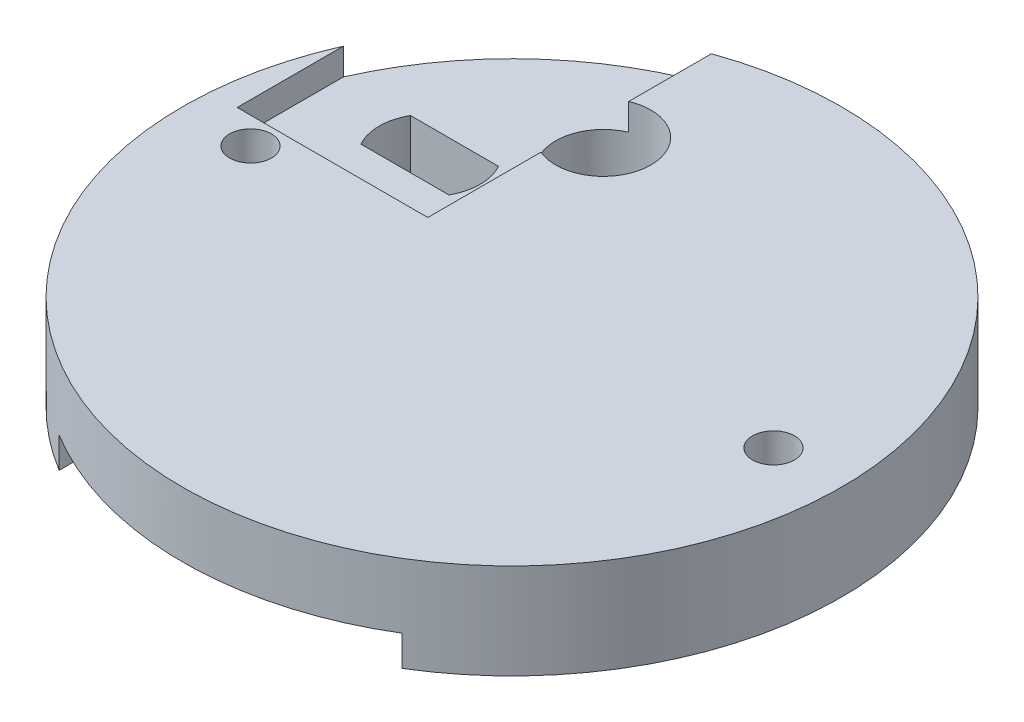
ISO-10303-21;
HEADER;
FILE_DESCRIPTION(('STEP AP214'),'2;1');
FILE_NAME('part.step','',(''),(''),'','','');
FILE_SCHEMA(('AUTOMOTIVE_DESIGN { 1 0 10303 214 1 1 1 1 }'));
ENDSEC;
DATA;
#1=APPLICATION_CONTEXT('core data for automotive mechanical design processes');
#2=APPLICATION_PROTOCOL_DEFINITION('international standard','automotive_design',2000,#1);
#3=PRODUCT_CONTEXT('',#1,'mechanical');
#4=PRODUCT('Part','Part','',(#3));
#5=PRODUCT_RELATED_PRODUCT_CATEGORY('part','',(#4));
#6=PRODUCT_DEFINITION_FORMATION('','',#4);
#7=PRODUCT_DEFINITION_CONTEXT('part definition',#1,'design');
#8=PRODUCT_DEFINITION('design','',#6,#7);
#9=PRODUCT_DEFINITION_SHAPE('','',#8);
#10=(LENGTH_UNIT() NAMED_UNIT(*) SI_UNIT(.MILLI.,.METRE.));
#11=(NAMED_UNIT(*) PLANE_ANGLE_UNIT() SI_UNIT($,.RADIAN.));
#12=(NAMED_UNIT(*) SI_UNIT($,.STERADIAN.) SOLID_ANGLE_UNIT());
#13=UNCERTAINTY_MEASURE_WITH_UNIT(LENGTH_MEASURE(1.E-05),#10,'distance_accuracy_value','');
#14=(GEOMETRIC_REPRESENTATION_CONTEXT(3) GLOBAL_UNCERTAINTY_ASSIGNED_CONTEXT((#13)) GLOBAL_UNIT_ASSIGNED_CONTEXT((#10,
#11,#12)) REPRESENTATION_CONTEXT('',''));
#15=CARTESIAN_POINT('',(0.,0.,0.));
#16=DIRECTION('',(0.,0.,1.));
#17=DIRECTION('',(1.,0.,0.));
#18=AXIS2_PLACEMENT_3D('',#15,#16,#17);
#19=CARTESIAN_POINT('',(-10.,4.,-5.68));
#20=DIRECTION('',(0.,-1.,0.));
#21=DIRECTION('',(0.,0.,-1.));
#22=AXIS2_PLACEMENT_3D('',#19,#20,#21);
#23=CYLINDRICAL_SURFACE('',#22,2.65);
#24=DIRECTION('',(0.,-1.,0.));
#25=VECTOR('',#24,1.);
#26=CARTESIAN_POINT('',(-12.3092206477511,4.,-6.98));
#27=LINE('',#26,#25);
#28=CARTESIAN_POINT('',(-12.3092206477511,3.6,-6.98));
#29=VERTEX_POINT('',#28);
#30=CARTESIAN_POINT('',(-12.3092206477511,0.,-6.98));
#31=VERTEX_POINT('',#30);
#32=EDGE_CURVE('E411',#29,#31,#27,.T.);
#33=ORIENTED_EDGE('',*,*,#32,.F.);
#34=CARTESIAN_POINT('',(-10.,3.6,-5.68));
#35=DIRECTION('',(0.,1.,0.));
#36=DIRECTION('',(0.,0.,1.));
#37=AXIS2_PLACEMENT_3D('',#34,#35,#36);
#38=CIRCLE('',#37,2.65);
#39=CARTESIAN_POINT('',(-12.3092206477511,3.6,-4.38));
#40=VERTEX_POINT('',#39);
#41=EDGE_CURVE('E50',#29,#40,#38,.T.);
#42=ORIENTED_EDGE('',*,*,#41,.T.);
#43=DIRECTION('',(0.,-1.,0.));
#44=VECTOR('',#43,1.);
#45=CARTESIAN_POINT('',(-12.3092206477511,4.,-4.38));
#46=LINE('',#45,#44);
#47=CARTESIAN_POINT('',(-12.3092206477511,0.,-4.38));
#48=VERTEX_POINT('',#47);
#49=EDGE_CURVE('E417',#40,#48,#46,.T.);
#50=ORIENTED_EDGE('',*,*,#49,.T.);
#51=CARTESIAN_POINT('',(-10.,0.,-5.68));
#52=DIRECTION('',(0.,1.,0.));
#53=DIRECTION('',(0.,0.,1.));
#54=AXIS2_PLACEMENT_3D('',#51,#52,#53);
#55=CIRCLE('',#54,2.65);
#56=EDGE_CURVE('E393',#31,#48,#55,.T.);
#57=ORIENTED_EDGE('',*,*,#56,.F.);
#58=EDGE_LOOP('',(#33,#42,#50,#57));
#59=FACE_BOUND('',#58,.T.);
#60=ADVANCED_FACE('F35',(#59),#23,.F.);
#61=CARTESIAN_POINT('',(-12.3092206477511,4.,-4.38));
#62=DIRECTION('',(0.,0.,-1.));
#63=DIRECTION('',(-1.,0.,0.));
#64=AXIS2_PLACEMENT_3D('',#61,#62,#63);
#65=PLANE('',#64);
#66=ORIENTED_EDGE('',*,*,#49,.F.);
#67=DIRECTION('',(1.,0.,0.));
#68=VECTOR('',#67,1.);
#69=CARTESIAN_POINT('',(-12.3092206477511,3.6,-4.38));
#70=LINE('',#69,#68);
#71=CARTESIAN_POINT('',(-7.6907793522489,3.6,-4.38));
#72=VERTEX_POINT('',#71);
#73=EDGE_CURVE('E273',#40,#72,#70,.T.);
#74=ORIENTED_EDGE('',*,*,#73,.T.);
#75=DIRECTION('',(0.,-1.,0.));
#76=VECTOR('',#75,1.);
#77=CARTESIAN_POINT('',(-7.6907793522489,4.,-4.38));
#78=LINE('',#77,#76);
#79=CARTESIAN_POINT('',(-7.6907793522489,0.,-4.38));
#80=VERTEX_POINT('',#79);
#81=EDGE_CURVE('E415',#72,#80,#78,.T.);
#82=ORIENTED_EDGE('',*,*,#81,.T.);
#83=DIRECTION('',(1.,0.,0.));
#84=VECTOR('',#83,1.);
#85=CARTESIAN_POINT('',(-12.3092206477511,0.,-4.38));
#86=LINE('',#85,#84);
#87=EDGE_CURVE('E402',#48,#80,#86,.T.);
#88=ORIENTED_EDGE('',*,*,#87,.F.);
#89=EDGE_LOOP('',(#66,#74,#82,#88));
#90=FACE_BOUND('',#89,.T.);
#91=ADVANCED_FACE('F516',(#90),#65,.T.);
#92=CARTESIAN_POINT('',(-10.,4.,-5.68));
#93=DIRECTION('',(0.,-1.,0.));
#94=DIRECTION('',(0.,0.,-1.));
#95=AXIS2_PLACEMENT_3D('',#92,#93,#94);
#96=CYLINDRICAL_SURFACE('',#95,2.65);
#97=ORIENTED_EDGE('',*,*,#81,.F.);
#98=CARTESIAN_POINT('',(-10.,3.6,-5.68));
#99=DIRECTION('',(0.,1.,0.));
#100=DIRECTION('',(0.,0.,1.));
#101=AXIS2_PLACEMENT_3D('',#98,#99,#100);
#102=CIRCLE('',#101,2.65);
#103=CARTESIAN_POINT('',(-7.6907793522489,3.6,-6.98));
#104=VERTEX_POINT('',#103);
#105=EDGE_CURVE('E270',#72,#104,#102,.T.);
#106=ORIENTED_EDGE('',*,*,#105,.T.);
#107=DIRECTION('',(0.,-1.,0.));
#108=VECTOR('',#107,1.);
#109=CARTESIAN_POINT('',(-7.6907793522489,4.,-6.98));
#110=LINE('',#109,#108);
#111=CARTESIAN_POINT('',(-7.6907793522489,0.,-6.98));
#112=VERTEX_POINT('',#111);
#113=EDGE_CURVE('E413',#104,#112,#110,.T.);
#114=ORIENTED_EDGE('',*,*,#113,.T.);
#115=CARTESIAN_POINT('',(-10.,0.,-5.68));
#116=DIRECTION('',(0.,1.,0.));
#117=DIRECTION('',(0.,0.,1.));
#118=AXIS2_PLACEMENT_3D('',#115,#116,#117);
#119=CIRCLE('',#118,2.65);
#120=EDGE_CURVE('E405',#80,#112,#119,.T.);
#121=ORIENTED_EDGE('',*,*,#120,.F.);
#122=EDGE_LOOP('',(#97,#106,#114,#121));
#123=FACE_BOUND('',#122,.T.);
#124=ADVANCED_FACE('F520',(#123),#96,.F.);
#125=CARTESIAN_POINT('',(-12.3092206477511,4.,-6.98));
#126=DIRECTION('',(0.,0.,1.));
#127=DIRECTION('',(1.,0.,0.));
#128=AXIS2_PLACEMENT_3D('',#125,#126,#127);
#129=PLANE('',#128);
#130=ORIENTED_EDGE('',*,*,#113,.F.);
#131=DIRECTION('',(-1.,0.,0.));
#132=VECTOR('',#131,1.);
#133=CARTESIAN_POINT('',(-12.3092206477511,3.6,-6.98));
#134=LINE('',#133,#132);
#135=EDGE_CURVE('E11',#104,#29,#134,.T.);
#136=ORIENTED_EDGE('',*,*,#135,.T.);
#137=ORIENTED_EDGE('',*,*,#32,.T.);
#138=DIRECTION('',(-1.,0.,0.));
#139=VECTOR('',#138,1.);
#140=CARTESIAN_POINT('',(-12.3092206477511,0.,-6.98));
#141=LINE('',#140,#139);
#142=EDGE_CURVE('E408',#112,#31,#141,.T.);
#143=ORIENTED_EDGE('',*,*,#142,.F.);
#144=EDGE_LOOP('',(#130,#136,#137,#143));
#145=FACE_BOUND('',#144,.T.);
#146=ADVANCED_FACE('F507',(#145),#129,.T.);
#147=CARTESIAN_POINT('',(0.,0.,0.));
#148=DIRECTION('',(0.,1.,0.));
#149=DIRECTION('',(0.,0.,1.));
#150=AXIS2_PLACEMENT_3D('',#147,#148,#149);
#151=PLANE('',#150);
#152=DIRECTION('',(1.,0.,0.));
#153=VECTOR('',#152,1.);
#154=CARTESIAN_POINT('',(6.,0.,-2.8));
#155=LINE('',#154,#153);
#156=CARTESIAN_POINT('',(6.,0.,-2.8));
#157=VERTEX_POINT('',#156);
#158=CARTESIAN_POINT('',(10.,0.,-2.8));
#159=VERTEX_POINT('',#158);
#160=EDGE_CURVE('E330',#157,#159,#155,.T.);
#161=ORIENTED_EDGE('',*,*,#160,.F.);
#162=DIRECTION('',(0.,0.,-1.));
#163=VECTOR('',#162,1.);
#164=CARTESIAN_POINT('',(6.,0.,0.6));
#165=LINE('',#164,#163);
#166=CARTESIAN_POINT('',(6.,0.,0.6));
#167=VERTEX_POINT('',#166);
#168=EDGE_CURVE('E328',#167,#157,#165,.T.);
#169=ORIENTED_EDGE('',*,*,#168,.F.);
#170=DIRECTION('',(-1.,0.,0.));
#171=VECTOR('',#170,1.);
#172=CARTESIAN_POINT('',(6.,0.,0.6));
#173=LINE('',#172,#171);
#174=CARTESIAN_POINT('',(10.,0.,0.6));
#175=VERTEX_POINT('',#174);
#176=EDGE_CURVE('E318',#175,#167,#173,.T.);
#177=ORIENTED_EDGE('',*,*,#176,.F.);
#178=DIRECTION('',(0.,0.,1.));
#179=VECTOR('',#178,1.);
#180=CARTESIAN_POINT('',(10.,0.,0.6));
#181=LINE('',#180,#179);
#182=EDGE_CURVE('E334',#159,#175,#181,.T.);
#183=ORIENTED_EDGE('',*,*,#182,.F.);
#184=EDGE_LOOP('',(#161,#169,#177,#183));
#185=FACE_BOUND('',#184,.T.);
#186=DIRECTION('',(1.,0.,0.));
#187=VECTOR('',#186,1.);
#188=CARTESIAN_POINT('',(-9.22,0.,-1.5));
#189=LINE('',#188,#187);
#190=CARTESIAN_POINT('',(-9.22,0.,-1.5));
#191=VERTEX_POINT('',#190);
#192=CARTESIAN_POINT('',(-5.22,0.,-1.5));
#193=VERTEX_POINT('',#192);
#194=EDGE_CURVE('E383',#191,#193,#189,.T.);
#195=ORIENTED_EDGE('',*,*,#194,.F.);
#196=DIRECTION('',(0.,0.,-1.));
#197=VECTOR('',#196,1.);
#198=CARTESIAN_POINT('',(-9.22,0.,3.3));
#199=LINE('',#198,#197);
#200=CARTESIAN_POINT('',(-9.22,0.,3.3));
#201=VERTEX_POINT('',#200);
#202=EDGE_CURVE('E341',#201,#191,#199,.T.);
#203=ORIENTED_EDGE('',*,*,#202,.F.);
#204=DIRECTION('',(-1.,0.,0.));
#205=VECTOR('',#204,1.);
#206=CARTESIAN_POINT('',(-9.22,0.,3.3));
#207=LINE('',#206,#205);
#208=CARTESIAN_POINT('',(-5.22,0.,3.3));
#209=VERTEX_POINT('',#208);
#210=EDGE_CURVE('E372',#209,#201,#207,.T.);
#211=ORIENTED_EDGE('',*,*,#210,.F.);
#212=DIRECTION('',(0.,0.,1.));
#213=VECTOR('',#212,1.);
#214=CARTESIAN_POINT('',(-5.22,0.,3.3));
#215=LINE('',#214,#213);
#216=EDGE_CURVE('E386',#193,#209,#215,.T.);
#217=ORIENTED_EDGE('',*,*,#216,.F.);
#218=EDGE_LOOP('',(#195,#203,#211,#217));
#219=FACE_BOUND('',#218,.T.);
#220=CARTESIAN_POINT('',(10.,0.,-5.68));
#221=DIRECTION('',(0.,1.,0.));
#222=DIRECTION('',(0.,0.,-1.));
#223=AXIS2_PLACEMENT_3D('',#220,#221,#222);
#224=CIRCLE('',#223,2.65);
#225=CARTESIAN_POINT('',(12.3092206477511,0.,-4.38));
#226=VERTEX_POINT('',#225);
#227=CARTESIAN_POINT('',(12.3092206477511,0.,-6.98));
#228=VERTEX_POINT('',#227);
#229=EDGE_CURVE('E419',#226,#228,#224,.T.);
#230=ORIENTED_EDGE('',*,*,#229,.T.);
#231=DIRECTION('',(-1.,0.,0.));
#232=VECTOR('',#231,1.);
#233=CARTESIAN_POINT('',(12.3092206477511,0.,-6.98));
#234=LINE('',#233,#232);
#235=CARTESIAN_POINT('',(7.6907793522489,0.,-6.98));
#236=VERTEX_POINT('',#235);
#237=EDGE_CURVE('E436',#228,#236,#234,.T.);
#238=ORIENTED_EDGE('',*,*,#237,.T.);
#239=CARTESIAN_POINT('',(10.,0.,-5.68));
#240=DIRECTION('',(0.,1.,0.));
#241=DIRECTION('',(0.,0.,-1.));
#242=AXIS2_PLACEMENT_3D('',#239,#240,#241);
#243=CIRCLE('',#242,2.65);
#244=CARTESIAN_POINT('',(7.6907793522489,0.,-4.38));
#245=VERTEX_POINT('',#244);
#246=EDGE_CURVE('E439',#236,#245,#243,.T.);
#247=ORIENTED_EDGE('',*,*,#246,.T.);
#248=DIRECTION('',(1.,0.,0.));
#249=VECTOR('',#248,1.);
#250=CARTESIAN_POINT('',(12.3092206477511,0.,-4.38));
#251=LINE('',#250,#249);
#252=EDGE_CURVE('E424',#245,#226,#251,.T.);
#253=ORIENTED_EDGE('',*,*,#252,.T.);
#254=EDGE_LOOP('',(#230,#238,#247,#253));
#255=FACE_BOUND('',#254,.T.);
#256=CARTESIAN_POINT('',(0.,0.,0.));
#257=DIRECTION('',(0.,1.,0.));
#258=DIRECTION('',(0.,0.,1.));
#259=AXIS2_PLACEMENT_3D('',#256,#257,#258);
#260=CIRCLE('',#259,17.29);
#261=CARTESIAN_POINT('',(-16.2881582752624,0.,5.8));
#262=VERTEX_POINT('',#261);
#263=CARTESIAN_POINT('',(-9.,0.,14.7629299260005));
#264=VERTEX_POINT('',#263);
#265=EDGE_CURVE('E462',#262,#264,#260,.T.);
#266=ORIENTED_EDGE('',*,*,#265,.F.);
#267=DIRECTION('',(-1.,0.,0.));
#268=VECTOR('',#267,1.);
#269=CARTESIAN_POINT('',(-17.1960489648058,0.,5.8));
#270=LINE('',#269,#268);
#271=CARTESIAN_POINT('',(-12.7960489648058,0.,5.8));
#272=VERTEX_POINT('',#271);
#273=EDGE_CURVE('E352',#272,#262,#270,.T.);
#274=ORIENTED_EDGE('',*,*,#273,.F.);
#275=DIRECTION('',(0.,0.,1.));
#276=VECTOR('',#275,1.);
#277=CARTESIAN_POINT('',(-12.7960489648058,0.,5.8));
#278=LINE('',#277,#276);
#279=CARTESIAN_POINT('',(-12.7960489648058,0.,1.8));
#280=VERTEX_POINT('',#279);
#281=EDGE_CURVE('E360',#280,#272,#278,.T.);
#282=ORIENTED_EDGE('',*,*,#281,.F.);
#283=DIRECTION('',(1.,0.,0.));
#284=VECTOR('',#283,1.);
#285=CARTESIAN_POINT('',(-17.1960489648058,0.,1.8));
#286=LINE('',#285,#284);
#287=CARTESIAN_POINT('',(-17.1960489648058,0.,1.8));
#288=VERTEX_POINT('',#287);
#289=EDGE_CURVE('E311',#288,#280,#286,.T.);
#290=ORIENTED_EDGE('',*,*,#289,.F.);
#291=CARTESIAN_POINT('',(9.,0.,14.7629299260005));
#292=VERTEX_POINT('',#291);
#293=EDGE_CURVE('E465',#292,#288,#260,.T.);
#294=ORIENTED_EDGE('',*,*,#293,.F.);
#295=DIRECTION('',(0.,0.,1.));
#296=VECTOR('',#295,1.);
#297=CARTESIAN_POINT('',(9.,0.,5.29));
#298=LINE('',#297,#296);
#299=CARTESIAN_POINT('',(9.,0.,5.29));
#300=VERTEX_POINT('',#299);
#301=EDGE_CURVE('E293',#300,#292,#298,.T.);
#302=ORIENTED_EDGE('',*,*,#301,.F.);
#303=DIRECTION('',(1.,0.,0.));
#304=VECTOR('',#303,1.);
#305=CARTESIAN_POINT('',(-9.,0.,5.29));
#306=LINE('',#305,#304);
#307=CARTESIAN_POINT('',(-9.,0.,5.29));
#308=VERTEX_POINT('',#307);
#309=EDGE_CURVE('E298',#308,#300,#306,.T.);
#310=ORIENTED_EDGE('',*,*,#309,.F.);
#311=DIRECTION('',(0.,0.,-1.));
#312=VECTOR('',#311,1.);
#313=CARTESIAN_POINT('',(-9.,0.,5.29));
#314=LINE('',#313,#312);
#315=EDGE_CURVE('E305',#264,#308,#314,.T.);
#316=ORIENTED_EDGE('',*,*,#315,.F.);
#317=EDGE_LOOP('',(#266,#274,#282,#290,#294,#302,#310,#316));
#318=FACE_BOUND('',#317,.T.);
#319=CARTESIAN_POINT('',(-13.72,0.,0.));
#320=DIRECTION('',(0.,1.,0.));
#321=DIRECTION('',(0.,0.,1.));
#322=AXIS2_PLACEMENT_3D('',#319,#320,#321);
#323=CIRCLE('',#322,1.1);
#324=CARTESIAN_POINT('',(-13.72,0.,1.1));
#325=VERTEX_POINT('',#324);
#326=EDGE_CURVE('E459',#325,#325,#323,.T.);
#327=ORIENTED_EDGE('',*,*,#326,.T.);
#328=EDGE_LOOP('',(#327));
#329=FACE_BOUND('',#328,.T.);
#330=CARTESIAN_POINT('',(13.72,0.,0.));
#331=DIRECTION('',(0.,1.,0.));
#332=DIRECTION('',(0.,0.,1.));
#333=AXIS2_PLACEMENT_3D('',#330,#331,#332);
#334=CIRCLE('',#333,1.1);
#335=CARTESIAN_POINT('',(13.72,0.,1.1));
#336=VERTEX_POINT('',#335);
#337=EDGE_CURVE('E456',#336,#336,#334,.T.);
#338=ORIENTED_EDGE('',*,*,#337,.T.);
#339=EDGE_LOOP('',(#338));
#340=FACE_BOUND('',#339,.T.);
#341=CARTESIAN_POINT('',(-4.85,0.,-9.64));
#342=DIRECTION('',(0.,1.,0.));
#343=DIRECTION('',(0.,0.,1.));
#344=AXIS2_PLACEMENT_3D('',#341,#342,#343);
#345=CIRCLE('',#344,2.5);
#346=CARTESIAN_POINT('',(-4.85,0.,-7.14));
#347=VERTEX_POINT('',#346);
#348=EDGE_CURVE('E453',#347,#347,#345,.T.);
#349=ORIENTED_EDGE('',*,*,#348,.T.);
#350=EDGE_LOOP('',(#349));
#351=FACE_BOUND('',#350,.T.);
#352=ORIENTED_EDGE('',*,*,#56,.T.);
#353=ORIENTED_EDGE('',*,*,#87,.T.);
#354=ORIENTED_EDGE('',*,*,#120,.T.);
#355=ORIENTED_EDGE('',*,*,#142,.T.);
#356=EDGE_LOOP('',(#352,#353,#354,#355));
#357=FACE_BOUND('',#356,.T.);
#358=ADVANCED_FACE('F504',(#185,#219,#255,#318,#329,#340,#351,#357),#151,.F.);
#359=CARTESIAN_POINT('',(0.,4.,0.));
#360=DIRECTION('',(0.,-1.,0.));
#361=DIRECTION('',(0.,0.,-1.));
#362=AXIS2_PLACEMENT_3D('',#359,#360,#361);
#363=CYLINDRICAL_SURFACE('',#362,17.29);
#364=CARTESIAN_POINT('',(0.,5.,0.));
#365=DIRECTION('',(0.,1.,0.));
#366=DIRECTION('',(0.,0.,1.));
#367=AXIS2_PLACEMENT_3D('',#364,#365,#366);
#368=CIRCLE('',#367,17.29);
#369=CARTESIAN_POINT('',(-15.82,5.,-6.97651058911257));
#370=VERTEX_POINT('',#369);
#371=CARTESIAN_POINT('',(-5.82,5.,-16.2810226951503));
#372=VERTEX_POINT('',#371);
#373=EDGE_CURVE('E290',#370,#372,#368,.T.);
#374=ORIENTED_EDGE('',*,*,#373,.F.);
#375=DIRECTION('',(0.,-1.,0.));
#376=VECTOR('',#375,1.);
#377=CARTESIAN_POINT('',(-15.82,4.,-6.97651058911257));
#378=LINE('',#377,#376);
#379=CARTESIAN_POINT('',(-15.82,3.6,-6.97651058911258));
#380=VERTEX_POINT('',#379);
#381=EDGE_CURVE('E268',#370,#380,#378,.T.);
#382=ORIENTED_EDGE('',*,*,#381,.T.);
#383=CARTESIAN_POINT('',(0.,3.6,0.));
#384=DIRECTION('',(0.,1.,0.));
#385=DIRECTION('',(0.,0.,1.));
#386=AXIS2_PLACEMENT_3D('',#383,#384,#385);
#387=CIRCLE('',#386,17.29);
#388=CARTESIAN_POINT('',(-5.82,3.6,-16.2810226951503));
#389=VERTEX_POINT('',#388);
#390=EDGE_CURVE('E239',#389,#380,#387,.T.);
#391=ORIENTED_EDGE('',*,*,#390,.F.);
#392=DIRECTION('',(0.,-1.,0.));
#393=VECTOR('',#392,1.);
#394=CARTESIAN_POINT('',(-5.82,4.,-16.2810226951503));
#395=LINE('',#394,#393);
#396=EDGE_CURVE('E265',#389,#372,#395,.F.);
#397=ORIENTED_EDGE('',*,*,#396,.T.);
#398=EDGE_LOOP('',(#374,#382,#391,#397));
#399=FACE_BOUND('',#398,.T.);
#400=CARTESIAN_POINT('',(0.,1.6,0.));
#401=DIRECTION('',(0.,-1.,0.));
#402=DIRECTION('',(0.,0.,-1.));
#403=AXIS2_PLACEMENT_3D('',#400,#401,#402);
#404=CIRCLE('',#403,17.29);
#405=CARTESIAN_POINT('',(-16.2881582752624,1.6,5.8));
#406=VERTEX_POINT('',#405);
#407=CARTESIAN_POINT('',(-17.1960489648058,1.6,1.8));
#408=VERTEX_POINT('',#407);
#409=EDGE_CURVE('E474',#406,#408,#404,.T.);
#410=ORIENTED_EDGE('',*,*,#409,.F.);
#411=DIRECTION('',(0.,-1.,0.));
#412=VECTOR('',#411,1.);
#413=CARTESIAN_POINT('',(-16.2881582752624,4.,5.8));
#414=LINE('',#413,#412);
#415=EDGE_CURVE('E476',#406,#262,#414,.T.);
#416=ORIENTED_EDGE('',*,*,#415,.T.);
#417=ORIENTED_EDGE('',*,*,#265,.T.);
#418=DIRECTION('',(0.,-1.,0.));
#419=VECTOR('',#418,1.);
#420=CARTESIAN_POINT('',(-9.,4.,14.7629299260005));
#421=LINE('',#420,#419);
#422=CARTESIAN_POINT('',(-9.,1.6,14.7629299260005));
#423=VERTEX_POINT('',#422);
#424=EDGE_CURVE('E468',#264,#423,#421,.F.);
#425=ORIENTED_EDGE('',*,*,#424,.T.);
#426=CARTESIAN_POINT('',(0.,1.6,0.));
#427=DIRECTION('',(0.,1.,0.));
#428=DIRECTION('',(0.,0.,1.));
#429=AXIS2_PLACEMENT_3D('',#426,#427,#428);
#430=CIRCLE('',#429,17.29);
#431=CARTESIAN_POINT('',(9.,1.6,14.7629299260005));
#432=VERTEX_POINT('',#431);
#433=EDGE_CURVE('E466',#423,#432,#430,.T.);
#434=ORIENTED_EDGE('',*,*,#433,.T.);
#435=DIRECTION('',(0.,-1.,0.));
#436=VECTOR('',#435,1.);
#437=CARTESIAN_POINT('',(9.,4.,14.7629299260005));
#438=LINE('',#437,#436);
#439=EDGE_CURVE('E471',#432,#292,#438,.T.);
#440=ORIENTED_EDGE('',*,*,#439,.T.);
#441=ORIENTED_EDGE('',*,*,#293,.T.);
#442=DIRECTION('',(0.,-1.,0.));
#443=VECTOR('',#442,1.);
#444=CARTESIAN_POINT('',(-17.1960489648058,1.6,1.8));
#445=LINE('',#444,#443);
#446=EDGE_CURVE('E357',#408,#288,#445,.T.);
#447=ORIENTED_EDGE('',*,*,#446,.F.);
#448=EDGE_LOOP('',(#410,#416,#417,#425,#434,#440,#441,#447));
#449=FACE_BOUND('',#448,.T.);
#450=ADVANCED_FACE('F37',(#399,#449),#363,.T.);
#451=CARTESIAN_POINT('',(-13.72,4.,0.));
#452=DIRECTION('',(0.,-1.,0.));
#453=DIRECTION('',(0.,0.,-1.));
#454=AXIS2_PLACEMENT_3D('',#451,#452,#453);
#455=CYLINDRICAL_SURFACE('',#454,1.1);
#456=ORIENTED_EDGE('',*,*,#326,.F.);
#457=EDGE_LOOP('',(#456));
#458=FACE_BOUND('',#457,.T.);
#459=CARTESIAN_POINT('',(-13.72,5.,0.));
#460=DIRECTION('',(0.,1.,0.));
#461=DIRECTION('',(0.,0.,1.));
#462=AXIS2_PLACEMENT_3D('',#459,#460,#461);
#463=CIRCLE('',#462,1.1);
#464=CARTESIAN_POINT('',(-13.72,5.,1.1));
#465=VERTEX_POINT('',#464);
#466=EDGE_CURVE('E284',#465,#465,#463,.T.);
#467=ORIENTED_EDGE('',*,*,#466,.T.);
#468=EDGE_LOOP('',(#467));
#469=FACE_BOUND('',#468,.T.);
#470=ADVANCED_FACE('F559',(#458,#469),#455,.F.);
#471=CARTESIAN_POINT('',(13.72,4.,0.));
#472=DIRECTION('',(0.,-1.,0.));
#473=DIRECTION('',(0.,0.,-1.));
#474=AXIS2_PLACEMENT_3D('',#471,#472,#473);
#475=CYLINDRICAL_SURFACE('',#474,1.1);
#476=ORIENTED_EDGE('',*,*,#337,.F.);
#477=EDGE_LOOP('',(#476));
#478=FACE_BOUND('',#477,.T.);
#479=CARTESIAN_POINT('',(13.72,5.,0.));
#480=DIRECTION('',(0.,1.,0.));
#481=DIRECTION('',(0.,0.,1.));
#482=AXIS2_PLACEMENT_3D('',#479,#480,#481);
#483=CIRCLE('',#482,1.1);
#484=CARTESIAN_POINT('',(13.72,5.,1.1));
#485=VERTEX_POINT('',#484);
#486=EDGE_CURVE('E281',#485,#485,#483,.T.);
#487=ORIENTED_EDGE('',*,*,#486,.T.);
#488=EDGE_LOOP('',(#487));
#489=FACE_BOUND('',#488,.T.);
#490=ADVANCED_FACE('F500',(#478,#489),#475,.F.);
#491=CARTESIAN_POINT('',(-4.85,4.,-9.64));
#492=DIRECTION('',(0.,-1.,0.));
#493=DIRECTION('',(0.,0.,-1.));
#494=AXIS2_PLACEMENT_3D('',#491,#492,#493);
#495=CYLINDRICAL_SURFACE('',#494,2.5);
#496=DIRECTION('',(0.,-1.,0.));
#497=VECTOR('',#496,1.);
#498=CARTESIAN_POINT('',(-5.82,4.,-7.33585156728131));
#499=LINE('',#498,#497);
#500=CARTESIAN_POINT('',(-5.82,5.,-7.33585156728131));
#501=VERTEX_POINT('',#500);
#502=CARTESIAN_POINT('',(-5.82,3.6,-7.33585156728131));
#503=VERTEX_POINT('',#502);
#504=EDGE_CURVE('E263',#501,#503,#499,.T.);
#505=ORIENTED_EDGE('',*,*,#504,.F.);
#506=CARTESIAN_POINT('',(-4.85,5.,-9.64));
#507=DIRECTION('',(0.,1.,0.));
#508=DIRECTION('',(0.,0.,1.));
#509=AXIS2_PLACEMENT_3D('',#506,#507,#508);
#510=CIRCLE('',#509,2.5);
#511=CARTESIAN_POINT('',(-5.82,5.,-11.9441484327187));
#512=VERTEX_POINT('',#511);
#513=EDGE_CURVE('E287',#501,#512,#510,.T.);
#514=ORIENTED_EDGE('',*,*,#513,.T.);
#515=DIRECTION('',(0.,-1.,0.));
#516=VECTOR('',#515,1.);
#517=CARTESIAN_POINT('',(-5.82,4.,-11.9441484327187));
#518=LINE('',#517,#516);
#519=CARTESIAN_POINT('',(-5.82,3.6,-11.9441484327187));
#520=VERTEX_POINT('',#519);
#521=EDGE_CURVE('E260',#520,#512,#518,.F.);
#522=ORIENTED_EDGE('',*,*,#521,.F.);
#523=CARTESIAN_POINT('',(-4.85,3.6,-9.64));
#524=DIRECTION('',(0.,1.,0.));
#525=DIRECTION('',(0.,0.,1.));
#526=AXIS2_PLACEMENT_3D('',#523,#524,#525);
#527=CIRCLE('',#526,2.5);
#528=EDGE_CURVE('E277',#520,#503,#527,.T.);
#529=ORIENTED_EDGE('',*,*,#528,.T.);
#530=EDGE_LOOP('',(#505,#514,#522,#529));
#531=FACE_BOUND('',#530,.T.);
#532=ORIENTED_EDGE('',*,*,#348,.F.);
#533=EDGE_LOOP('',(#532));
#534=FACE_BOUND('',#533,.T.);
#535=ADVANCED_FACE('F496',(#531,#534),#495,.F.);
#536=CARTESIAN_POINT('',(10.,4.,-5.68));
#537=DIRECTION('',(0.,-1.,0.));
#538=DIRECTION('',(0.,0.,-1.));
#539=AXIS2_PLACEMENT_3D('',#536,#537,#538);
#540=CYLINDRICAL_SURFACE('',#539,2.65);
#541=ORIENTED_EDGE('',*,*,#229,.F.);
#542=DIRECTION('',(0.,-1.,0.));
#543=VECTOR('',#542,1.);
#544=CARTESIAN_POINT('',(12.3092206477511,4.,-4.38));
#545=LINE('',#544,#543);
#546=CARTESIAN_POINT('',(12.3092206477511,4.,-4.38));
#547=VERTEX_POINT('',#546);
#548=EDGE_CURVE('E433',#547,#226,#545,.T.);
#549=ORIENTED_EDGE('',*,*,#548,.F.);
#550=CARTESIAN_POINT('',(10.,4.,-5.68));
#551=DIRECTION('',(0.,1.,0.));
#552=DIRECTION('',(0.,0.,-1.));
#553=AXIS2_PLACEMENT_3D('',#550,#551,#552);
#554=CIRCLE('',#553,2.65);
#555=CARTESIAN_POINT('',(12.3092206477511,4.,-6.98));
#556=VERTEX_POINT('',#555);
#557=EDGE_CURVE('E420',#547,#556,#554,.T.);
#558=ORIENTED_EDGE('',*,*,#557,.T.);
#559=DIRECTION('',(0.,-1.,0.));
#560=VECTOR('',#559,1.);
#561=CARTESIAN_POINT('',(12.3092206477511,4.,-6.98));
#562=LINE('',#561,#560);
#563=EDGE_CURVE('E450',#556,#228,#562,.T.);
#564=ORIENTED_EDGE('',*,*,#563,.T.);
#565=EDGE_LOOP('',(#541,#549,#558,#564));
#566=FACE_BOUND('',#565,.T.);
#567=ADVANCED_FACE('F499',(#566),#540,.F.);
#568=CARTESIAN_POINT('',(12.3092206477511,4.,-6.98));
#569=DIRECTION('',(0.,0.,1.));
#570=DIRECTION('',(1.,0.,0.));
#571=AXIS2_PLACEMENT_3D('',#568,#569,#570);
#572=PLANE('',#571);
#573=ORIENTED_EDGE('',*,*,#237,.F.);
#574=ORIENTED_EDGE('',*,*,#563,.F.);
#575=DIRECTION('',(-1.,0.,0.));
#576=VECTOR('',#575,1.);
#577=CARTESIAN_POINT('',(12.3092206477511,4.,-6.98));
#578=LINE('',#577,#576);
#579=CARTESIAN_POINT('',(7.6907793522489,4.,-6.98));
#580=VERTEX_POINT('',#579);
#581=EDGE_CURVE('E423',#556,#580,#578,.T.);
#582=ORIENTED_EDGE('',*,*,#581,.T.);
#583=DIRECTION('',(0.,-1.,0.));
#584=VECTOR('',#583,1.);
#585=CARTESIAN_POINT('',(7.6907793522489,4.,-6.98));
#586=LINE('',#585,#584);
#587=EDGE_CURVE('E448',#580,#236,#586,.T.);
#588=ORIENTED_EDGE('',*,*,#587,.T.);
#589=EDGE_LOOP('',(#573,#574,#582,#588));
#590=FACE_BOUND('',#589,.T.);
#591=ADVANCED_FACE('F549',(#590),#572,.T.);
#592=CARTESIAN_POINT('',(10.,4.,-5.68));
#593=DIRECTION('',(0.,-1.,0.));
#594=DIRECTION('',(0.,0.,-1.));
#595=AXIS2_PLACEMENT_3D('',#592,#593,#594);
#596=CYLINDRICAL_SURFACE('',#595,2.65);
#597=ORIENTED_EDGE('',*,*,#246,.F.);
#598=ORIENTED_EDGE('',*,*,#587,.F.);
#599=CARTESIAN_POINT('',(10.,4.,-5.68));
#600=DIRECTION('',(0.,1.,0.));
#601=DIRECTION('',(0.,0.,-1.));
#602=AXIS2_PLACEMENT_3D('',#599,#600,#601);
#603=CIRCLE('',#602,2.65);
#604=CARTESIAN_POINT('',(7.6907793522489,4.,-4.38));
#605=VERTEX_POINT('',#604);
#606=EDGE_CURVE('E427',#580,#605,#603,.T.);
#607=ORIENTED_EDGE('',*,*,#606,.T.);
#608=DIRECTION('',(0.,-1.,0.));
#609=VECTOR('',#608,1.);
#610=CARTESIAN_POINT('',(7.6907793522489,4.,-4.38));
#611=LINE('',#610,#609);
#612=EDGE_CURVE('E446',#605,#245,#611,.T.);
#613=ORIENTED_EDGE('',*,*,#612,.T.);
#614=EDGE_LOOP('',(#597,#598,#607,#613));
#615=FACE_BOUND('',#614,.T.);
#616=ADVANCED_FACE('F545',(#615),#596,.F.);
#617=CARTESIAN_POINT('',(12.3092206477511,4.,-4.38));
#618=DIRECTION('',(0.,0.,-1.));
#619=DIRECTION('',(-1.,0.,0.));
#620=AXIS2_PLACEMENT_3D('',#617,#618,#619);
#621=PLANE('',#620);
#622=ORIENTED_EDGE('',*,*,#252,.F.);
#623=ORIENTED_EDGE('',*,*,#612,.F.);
#624=DIRECTION('',(1.,0.,0.));
#625=VECTOR('',#624,1.);
#626=CARTESIAN_POINT('',(12.3092206477511,4.,-4.38));
#627=LINE('',#626,#625);
#628=EDGE_CURVE('E430',#605,#547,#627,.T.);
#629=ORIENTED_EDGE('',*,*,#628,.T.);
#630=ORIENTED_EDGE('',*,*,#548,.T.);
#631=EDGE_LOOP('',(#622,#623,#629,#630));
#632=FACE_BOUND('',#631,.T.);
#633=ADVANCED_FACE('F541',(#632),#621,.T.);
#634=CARTESIAN_POINT('',(9.,1.6,5.29));
#635=DIRECTION('',(1.,0.,0.));
#636=DIRECTION('',(0.,0.,-1.));
#637=AXIS2_PLACEMENT_3D('',#634,#635,#636);
#638=PLANE('',#637);
#639=DIRECTION('',(0.,0.,1.));
#640=VECTOR('',#639,1.);
#641=CARTESIAN_POINT('',(9.,1.6,5.29));
#642=LINE('',#641,#640);
#643=CARTESIAN_POINT('',(9.,1.6,5.29));
#644=VERTEX_POINT('',#643);
#645=EDGE_CURVE('E294',#644,#432,#642,.T.);
#646=ORIENTED_EDGE('',*,*,#645,.F.);
#647=DIRECTION('',(0.,-1.,0.));
#648=VECTOR('',#647,1.);
#649=CARTESIAN_POINT('',(9.,1.6,5.29));
#650=LINE('',#649,#648);
#651=EDGE_CURVE('E309',#644,#300,#650,.T.);
#652=ORIENTED_EDGE('',*,*,#651,.T.);
#653=ORIENTED_EDGE('',*,*,#301,.T.);
#654=ORIENTED_EDGE('',*,*,#439,.F.);
#655=EDGE_LOOP('',(#646,#652,#653,#654));
#656=FACE_BOUND('',#655,.T.);
#657=ADVANCED_FACE('F544',(#656),#638,.F.);
#658=CARTESIAN_POINT('',(-9.,1.6,5.29));
#659=DIRECTION('',(-1.,0.,0.));
#660=DIRECTION('',(0.,0.,1.));
#661=AXIS2_PLACEMENT_3D('',#658,#659,#660);
#662=PLANE('',#661);
#663=ORIENTED_EDGE('',*,*,#315,.T.);
#664=DIRECTION('',(0.,-1.,0.));
#665=VECTOR('',#664,1.);
#666=CARTESIAN_POINT('',(-9.,1.6,5.29));
#667=LINE('',#666,#665);
#668=CARTESIAN_POINT('',(-9.,1.6,5.29));
#669=VERTEX_POINT('',#668);
#670=EDGE_CURVE('E303',#669,#308,#667,.T.);
#671=ORIENTED_EDGE('',*,*,#670,.F.);
#672=DIRECTION('',(0.,0.,-1.));
#673=VECTOR('',#672,1.);
#674=CARTESIAN_POINT('',(-9.,1.6,5.29));
#675=LINE('',#674,#673);
#676=EDGE_CURVE('E297',#423,#669,#675,.T.);
#677=ORIENTED_EDGE('',*,*,#676,.F.);
#678=ORIENTED_EDGE('',*,*,#424,.F.);
#679=EDGE_LOOP('',(#663,#671,#677,#678));
#680=FACE_BOUND('',#679,.T.);
#681=ADVANCED_FACE('F813',(#680),#662,.F.);
#682=CARTESIAN_POINT('',(0.,1.6,0.));
#683=DIRECTION('',(0.,1.,0.));
#684=DIRECTION('',(0.,0.,1.));
#685=AXIS2_PLACEMENT_3D('',#682,#683,#684);
#686=PLANE('',#685);
#687=ORIENTED_EDGE('',*,*,#433,.F.);
#688=ORIENTED_EDGE('',*,*,#676,.T.);
#689=DIRECTION('',(1.,0.,0.));
#690=VECTOR('',#689,1.);
#691=CARTESIAN_POINT('',(-9.,1.6,5.29));
#692=LINE('',#691,#690);
#693=EDGE_CURVE('E300',#669,#644,#692,.T.);
#694=ORIENTED_EDGE('',*,*,#693,.T.);
#695=ORIENTED_EDGE('',*,*,#645,.T.);
#696=EDGE_LOOP('',(#687,#688,#694,#695));
#697=FACE_BOUND('',#696,.T.);
#698=ADVANCED_FACE('F803',(#697),#686,.F.);
#699=CARTESIAN_POINT('',(-9.,1.6,5.29));
#700=DIRECTION('',(0.,0.,-1.));
#701=DIRECTION('',(-1.,0.,0.));
#702=AXIS2_PLACEMENT_3D('',#699,#700,#701);
#703=PLANE('',#702);
#704=ORIENTED_EDGE('',*,*,#309,.T.);
#705=ORIENTED_EDGE('',*,*,#651,.F.);
#706=ORIENTED_EDGE('',*,*,#693,.F.);
#707=ORIENTED_EDGE('',*,*,#670,.T.);
#708=EDGE_LOOP('',(#704,#705,#706,#707));
#709=FACE_BOUND('',#708,.T.);
#710=ADVANCED_FACE('F793',(#709),#703,.F.);
#711=CARTESIAN_POINT('',(-17.1960489648058,1.6,5.8));
#712=DIRECTION('',(0.,0.,1.));
#713=DIRECTION('',(1.,0.,0.));
#714=AXIS2_PLACEMENT_3D('',#711,#712,#713);
#715=PLANE('',#714);
#716=DIRECTION('',(-1.,0.,0.));
#717=VECTOR('',#716,1.);
#718=CARTESIAN_POINT('',(-17.1960489648058,1.6,5.8));
#719=LINE('',#718,#717);
#720=CARTESIAN_POINT('',(-12.7960489648058,1.6,5.8));
#721=VERTEX_POINT('',#720);
#722=EDGE_CURVE('E355',#721,#406,#719,.T.);
#723=ORIENTED_EDGE('',*,*,#722,.F.);
#724=DIRECTION('',(0.,-1.,0.));
#725=VECTOR('',#724,1.);
#726=CARTESIAN_POINT('',(-12.7960489648058,1.6,5.8));
#727=LINE('',#726,#725);
#728=EDGE_CURVE('E331',#721,#272,#727,.T.);
#729=ORIENTED_EDGE('',*,*,#728,.T.);
#730=ORIENTED_EDGE('',*,*,#273,.T.);
#731=ORIENTED_EDGE('',*,*,#415,.F.);
#732=EDGE_LOOP('',(#723,#729,#730,#731));
#733=FACE_BOUND('',#732,.T.);
#734=ADVANCED_FACE('F783',(#733),#715,.F.);
#735=CARTESIAN_POINT('',(0.,1.6,0.));
#736=DIRECTION('',(0.,-1.,0.));
#737=DIRECTION('',(0.,0.,-1.));
#738=AXIS2_PLACEMENT_3D('',#735,#736,#737);
#739=PLANE('',#738);
#740=ORIENTED_EDGE('',*,*,#409,.T.);
#741=DIRECTION('',(1.,0.,0.));
#742=VECTOR('',#741,1.);
#743=CARTESIAN_POINT('',(-17.1960489648058,1.6,1.8));
#744=LINE('',#743,#742);
#745=CARTESIAN_POINT('',(-12.7960489648058,1.6,1.8));
#746=VERTEX_POINT('',#745);
#747=EDGE_CURVE('E348',#408,#746,#744,.T.);
#748=ORIENTED_EDGE('',*,*,#747,.T.);
#749=DIRECTION('',(0.,0.,1.));
#750=VECTOR('',#749,1.);
#751=CARTESIAN_POINT('',(-12.7960489648058,1.6,5.8));
#752=LINE('',#751,#750);
#753=EDGE_CURVE('E351',#746,#721,#752,.T.);
#754=ORIENTED_EDGE('',*,*,#753,.T.);
#755=ORIENTED_EDGE('',*,*,#722,.T.);
#756=EDGE_LOOP('',(#740,#748,#754,#755));
#757=FACE_BOUND('',#756,.T.);
#758=ADVANCED_FACE('F773',(#757),#739,.T.);
#759=CARTESIAN_POINT('',(-12.7960489648058,1.6,5.8));
#760=DIRECTION('',(1.,0.,0.));
#761=DIRECTION('',(0.,0.,-1.));
#762=AXIS2_PLACEMENT_3D('',#759,#760,#761);
#763=PLANE('',#762);
#764=ORIENTED_EDGE('',*,*,#281,.T.);
#765=ORIENTED_EDGE('',*,*,#728,.F.);
#766=ORIENTED_EDGE('',*,*,#753,.F.);
#767=DIRECTION('',(0.,-1.,0.));
#768=VECTOR('',#767,1.);
#769=CARTESIAN_POINT('',(-12.7960489648058,1.6,1.8));
#770=LINE('',#769,#768);
#771=EDGE_CURVE('E365',#746,#280,#770,.T.);
#772=ORIENTED_EDGE('',*,*,#771,.T.);
#773=EDGE_LOOP('',(#764,#765,#766,#772));
#774=FACE_BOUND('',#773,.T.);
#775=ADVANCED_FACE('F763',(#774),#763,.F.);
#776=CARTESIAN_POINT('',(-17.1960489648058,1.6,1.8));
#777=DIRECTION('',(0.,0.,-1.));
#778=DIRECTION('',(-1.,0.,0.));
#779=AXIS2_PLACEMENT_3D('',#776,#777,#778);
#780=PLANE('',#779);
#781=ORIENTED_EDGE('',*,*,#289,.T.);
#782=ORIENTED_EDGE('',*,*,#771,.F.);
#783=ORIENTED_EDGE('',*,*,#747,.F.);
#784=ORIENTED_EDGE('',*,*,#446,.T.);
#785=EDGE_LOOP('',(#781,#782,#783,#784));
#786=FACE_BOUND('',#785,.T.);
#787=ADVANCED_FACE('F753',(#786),#780,.F.);
#788=CARTESIAN_POINT('',(-9.22,1.6,3.3));
#789=DIRECTION('',(-1.,0.,0.));
#790=DIRECTION('',(0.,0.,1.));
#791=AXIS2_PLACEMENT_3D('',#788,#789,#790);
#792=PLANE('',#791);
#793=ORIENTED_EDGE('',*,*,#202,.T.);
#794=DIRECTION('',(0.,-1.,0.));
#795=VECTOR('',#794,1.);
#796=CARTESIAN_POINT('',(-9.22,1.6,-1.5));
#797=LINE('',#796,#795);
#798=CARTESIAN_POINT('',(-9.22,1.6,-1.5));
#799=VERTEX_POINT('',#798);
#800=EDGE_CURVE('E381',#799,#191,#797,.T.);
#801=ORIENTED_EDGE('',*,*,#800,.F.);
#802=DIRECTION('',(0.,0.,-1.));
#803=VECTOR('',#802,1.);
#804=CARTESIAN_POINT('',(-9.22,1.6,3.3));
#805=LINE('',#804,#803);
#806=CARTESIAN_POINT('',(-9.22,1.6,3.3));
#807=VERTEX_POINT('',#806);
#808=EDGE_CURVE('E368',#807,#799,#805,.T.);
#809=ORIENTED_EDGE('',*,*,#808,.F.);
#810=DIRECTION('',(0.,-1.,0.));
#811=VECTOR('',#810,1.);
#812=CARTESIAN_POINT('',(-9.22,1.6,3.3));
#813=LINE('',#812,#811);
#814=EDGE_CURVE('E391',#807,#201,#813,.T.);
#815=ORIENTED_EDGE('',*,*,#814,.T.);
#816=EDGE_LOOP('',(#793,#801,#809,#815));
#817=FACE_BOUND('',#816,.T.);
#818=ADVANCED_FACE('F743',(#817),#792,.F.);
#819=CARTESIAN_POINT('',(-9.22,1.6,3.3));
#820=DIRECTION('',(0.,0.,1.));
#821=DIRECTION('',(1.,0.,0.));
#822=AXIS2_PLACEMENT_3D('',#819,#820,#821);
#823=PLANE('',#822);
#824=ORIENTED_EDGE('',*,*,#210,.T.);
#825=ORIENTED_EDGE('',*,*,#814,.F.);
#826=DIRECTION('',(-1.,0.,0.));
#827=VECTOR('',#826,1.);
#828=CARTESIAN_POINT('',(-9.22,1.6,3.3));
#829=LINE('',#828,#827);
#830=CARTESIAN_POINT('',(-5.22,1.6,3.3));
#831=VERTEX_POINT('',#830);
#832=EDGE_CURVE('E378',#831,#807,#829,.T.);
#833=ORIENTED_EDGE('',*,*,#832,.F.);
#834=DIRECTION('',(0.,-1.,0.));
#835=VECTOR('',#834,1.);
#836=CARTESIAN_POINT('',(-5.22,1.6,3.3));
#837=LINE('',#836,#835);
#838=EDGE_CURVE('E394',#831,#209,#837,.T.);
#839=ORIENTED_EDGE('',*,*,#838,.T.);
#840=EDGE_LOOP('',(#824,#825,#833,#839));
#841=FACE_BOUND('',#840,.T.);
#842=ADVANCED_FACE('F733',(#841),#823,.F.);
#843=CARTESIAN_POINT('',(-5.22,1.6,3.3));
#844=DIRECTION('',(1.,0.,0.));
#845=DIRECTION('',(0.,0.,-1.));
#846=AXIS2_PLACEMENT_3D('',#843,#844,#845);
#847=PLANE('',#846);
#848=ORIENTED_EDGE('',*,*,#216,.T.);
#849=ORIENTED_EDGE('',*,*,#838,.F.);
#850=DIRECTION('',(0.,0.,1.));
#851=VECTOR('',#850,1.);
#852=CARTESIAN_POINT('',(-5.22,1.6,3.3));
#853=LINE('',#852,#851);
#854=CARTESIAN_POINT('',(-5.22,1.6,-1.5));
#855=VERTEX_POINT('',#854);
#856=EDGE_CURVE('E375',#855,#831,#853,.T.);
#857=ORIENTED_EDGE('',*,*,#856,.F.);
#858=DIRECTION('',(0.,-1.,0.));
#859=VECTOR('',#858,1.);
#860=CARTESIAN_POINT('',(-5.22,1.6,-1.5));
#861=LINE('',#860,#859);
#862=EDGE_CURVE('E396',#855,#193,#861,.T.);
#863=ORIENTED_EDGE('',*,*,#862,.T.);
#864=EDGE_LOOP('',(#848,#849,#857,#863));
#865=FACE_BOUND('',#864,.T.);
#866=ADVANCED_FACE('F723',(#865),#847,.F.);
#867=CARTESIAN_POINT('',(-9.22,1.6,-1.5));
#868=DIRECTION('',(0.,0.,-1.));
#869=DIRECTION('',(-1.,0.,0.));
#870=AXIS2_PLACEMENT_3D('',#867,#868,#869);
#871=PLANE('',#870);
#872=ORIENTED_EDGE('',*,*,#194,.T.);
#873=ORIENTED_EDGE('',*,*,#862,.F.);
#874=DIRECTION('',(1.,0.,0.));
#875=VECTOR('',#874,1.);
#876=CARTESIAN_POINT('',(-9.22,1.6,-1.5));
#877=LINE('',#876,#875);
#878=EDGE_CURVE('E371',#799,#855,#877,.T.);
#879=ORIENTED_EDGE('',*,*,#878,.F.);
#880=ORIENTED_EDGE('',*,*,#800,.T.);
#881=EDGE_LOOP('',(#872,#873,#879,#880));
#882=FACE_BOUND('',#881,.T.);
#883=ADVANCED_FACE('F713',(#882),#871,.F.);
#884=CARTESIAN_POINT('',(0.,1.6,0.));
#885=DIRECTION('',(0.,-1.,0.));
#886=DIRECTION('',(0.,0.,-1.));
#887=AXIS2_PLACEMENT_3D('',#884,#885,#886);
#888=PLANE('',#887);
#889=ORIENTED_EDGE('',*,*,#808,.T.);
#890=ORIENTED_EDGE('',*,*,#878,.T.);
#891=ORIENTED_EDGE('',*,*,#856,.T.);
#892=ORIENTED_EDGE('',*,*,#832,.T.);
#893=EDGE_LOOP('',(#889,#890,#891,#892));
#894=FACE_BOUND('',#893,.T.);
#895=ADVANCED_FACE('F703',(#894),#888,.T.);
#896=CARTESIAN_POINT('',(6.,1.6,0.6));
#897=DIRECTION('',(-1.,0.,0.));
#898=DIRECTION('',(0.,0.,1.));
#899=AXIS2_PLACEMENT_3D('',#896,#897,#898);
#900=PLANE('',#899);
#901=ORIENTED_EDGE('',*,*,#168,.T.);
#902=DIRECTION('',(0.,-1.,0.));
#903=VECTOR('',#902,1.);
#904=CARTESIAN_POINT('',(6.,1.6,-2.8));
#905=LINE('',#904,#903);
#906=CARTESIAN_POINT('',(6.,1.6,-2.8));
#907=VERTEX_POINT('',#906);
#908=EDGE_CURVE('E327',#907,#157,#905,.T.);
#909=ORIENTED_EDGE('',*,*,#908,.F.);
#910=DIRECTION('',(0.,0.,-1.));
#911=VECTOR('',#910,1.);
#912=CARTESIAN_POINT('',(6.,1.6,0.6));
#913=LINE('',#912,#911);
#914=CARTESIAN_POINT('',(6.,1.6,0.6));
#915=VERTEX_POINT('',#914);
#916=EDGE_CURVE('E314',#915,#907,#913,.T.);
#917=ORIENTED_EDGE('',*,*,#916,.F.);
#918=DIRECTION('',(0.,-1.,0.));
#919=VECTOR('',#918,1.);
#920=CARTESIAN_POINT('',(6.,1.6,0.6));
#921=LINE('',#920,#919);
#922=EDGE_CURVE('E339',#915,#167,#921,.T.);
#923=ORIENTED_EDGE('',*,*,#922,.T.);
#924=EDGE_LOOP('',(#901,#909,#917,#923));
#925=FACE_BOUND('',#924,.T.);
#926=ADVANCED_FACE('F693',(#925),#900,.F.);
#927=CARTESIAN_POINT('',(6.,1.6,0.6));
#928=DIRECTION('',(0.,0.,1.));
#929=DIRECTION('',(1.,0.,0.));
#930=AXIS2_PLACEMENT_3D('',#927,#928,#929);
#931=PLANE('',#930);
#932=ORIENTED_EDGE('',*,*,#176,.T.);
#933=ORIENTED_EDGE('',*,*,#922,.F.);
#934=DIRECTION('',(-1.,0.,0.));
#935=VECTOR('',#934,1.);
#936=CARTESIAN_POINT('',(6.,1.6,0.6));
#937=LINE('',#936,#935);
#938=CARTESIAN_POINT('',(10.,1.6,0.6));
#939=VERTEX_POINT('',#938);
#940=EDGE_CURVE('E324',#939,#915,#937,.T.);
#941=ORIENTED_EDGE('',*,*,#940,.F.);
#942=DIRECTION('',(0.,-1.,0.));
#943=VECTOR('',#942,1.);
#944=CARTESIAN_POINT('',(10.,1.6,0.6));
#945=LINE('',#944,#943);
#946=EDGE_CURVE('E342',#939,#175,#945,.T.);
#947=ORIENTED_EDGE('',*,*,#946,.T.);
#948=EDGE_LOOP('',(#932,#933,#941,#947));
#949=FACE_BOUND('',#948,.T.);
#950=ADVANCED_FACE('F683',(#949),#931,.F.);
#951=CARTESIAN_POINT('',(10.,1.6,0.6));
#952=DIRECTION('',(1.,0.,0.));
#953=DIRECTION('',(0.,0.,-1.));
#954=AXIS2_PLACEMENT_3D('',#951,#952,#953);
#955=PLANE('',#954);
#956=ORIENTED_EDGE('',*,*,#182,.T.);
#957=ORIENTED_EDGE('',*,*,#946,.F.);
#958=DIRECTION('',(0.,0.,1.));
#959=VECTOR('',#958,1.);
#960=CARTESIAN_POINT('',(10.,1.6,0.6));
#961=LINE('',#960,#959);
#962=CARTESIAN_POINT('',(10.,1.6,-2.8));
#963=VERTEX_POINT('',#962);
#964=EDGE_CURVE('E321',#963,#939,#961,.T.);
#965=ORIENTED_EDGE('',*,*,#964,.F.);
#966=DIRECTION('',(0.,-1.,0.));
#967=VECTOR('',#966,1.);
#968=CARTESIAN_POINT('',(10.,1.6,-2.8));
#969=LINE('',#968,#967);
#970=EDGE_CURVE('E344',#963,#159,#969,.T.);
#971=ORIENTED_EDGE('',*,*,#970,.T.);
#972=EDGE_LOOP('',(#956,#957,#965,#971));
#973=FACE_BOUND('',#972,.T.);
#974=ADVANCED_FACE('F673',(#973),#955,.F.);
#975=CARTESIAN_POINT('',(6.,1.6,-2.8));
#976=DIRECTION('',(0.,0.,-1.));
#977=DIRECTION('',(-1.,0.,0.));
#978=AXIS2_PLACEMENT_3D('',#975,#976,#977);
#979=PLANE('',#978);
#980=ORIENTED_EDGE('',*,*,#160,.T.);
#981=ORIENTED_EDGE('',*,*,#970,.F.);
#982=DIRECTION('',(1.,0.,0.));
#983=VECTOR('',#982,1.);
#984=CARTESIAN_POINT('',(6.,1.6,-2.8));
#985=LINE('',#984,#983);
#986=EDGE_CURVE('E317',#907,#963,#985,.T.);
#987=ORIENTED_EDGE('',*,*,#986,.F.);
#988=ORIENTED_EDGE('',*,*,#908,.T.);
#989=EDGE_LOOP('',(#980,#981,#987,#988));
#990=FACE_BOUND('',#989,.T.);
#991=ADVANCED_FACE('F663',(#990),#979,.F.);
#992=CARTESIAN_POINT('',(0.,1.6,0.));
#993=DIRECTION('',(0.,-1.,0.));
#994=DIRECTION('',(0.,0.,-1.));
#995=AXIS2_PLACEMENT_3D('',#992,#993,#994);
#996=PLANE('',#995);
#997=ORIENTED_EDGE('',*,*,#916,.T.);
#998=ORIENTED_EDGE('',*,*,#986,.T.);
#999=ORIENTED_EDGE('',*,*,#964,.T.);
#1000=ORIENTED_EDGE('',*,*,#940,.T.);
#1001=EDGE_LOOP('',(#997,#998,#999,#1000));
#1002=FACE_BOUND('',#1001,.T.);
#1003=ADVANCED_FACE('F612',(#1002),#996,.T.);
#1004=CARTESIAN_POINT('',(0.,4.,0.));
#1005=DIRECTION('',(0.,1.,0.));
#1006=DIRECTION('',(0.,0.,1.));
#1007=AXIS2_PLACEMENT_3D('',#1004,#1005,#1006);
#1008=PLANE('',#1007);
#1009=ORIENTED_EDGE('',*,*,#581,.F.);
#1010=ORIENTED_EDGE('',*,*,#557,.F.);
#1011=ORIENTED_EDGE('',*,*,#628,.F.);
#1012=ORIENTED_EDGE('',*,*,#606,.F.);
#1013=EDGE_LOOP('',(#1009,#1010,#1011,#1012));
#1014=FACE_BOUND('',#1013,.T.);
#1015=ADVANCED_FACE('F530',(#1014),#1008,.F.);
#1016=CARTESIAN_POINT('',(0.,5.,0.));
#1017=DIRECTION('',(0.,1.,0.));
#1018=DIRECTION('',(0.,0.,1.));
#1019=AXIS2_PLACEMENT_3D('',#1016,#1017,#1018);
#1020=PLANE('',#1019);
#1021=DIRECTION('',(0.,0.,-1.));
#1022=VECTOR('',#1021,1.);
#1023=CARTESIAN_POINT('',(-5.82,5.,0.));
#1024=LINE('',#1023,#1022);
#1025=EDGE_CURVE('E43',#512,#372,#1024,.T.);
#1026=ORIENTED_EDGE('',*,*,#1025,.F.);
#1027=ORIENTED_EDGE('',*,*,#513,.F.);
#1028=DIRECTION('',(0.,0.,-1.));
#1029=VECTOR('',#1028,1.);
#1030=CARTESIAN_POINT('',(-5.82,5.,-16.4));
#1031=LINE('',#1030,#1029);
#1032=CARTESIAN_POINT('',(-5.82,5.,-1.4));
#1033=VERTEX_POINT('',#1032);
#1034=EDGE_CURVE('E242',#1033,#501,#1031,.T.);
#1035=ORIENTED_EDGE('',*,*,#1034,.F.);
#1036=DIRECTION('',(1.,0.,0.));
#1037=VECTOR('',#1036,1.);
#1038=CARTESIAN_POINT('',(-15.82,5.,-1.4));
#1039=LINE('',#1038,#1037);
#1040=CARTESIAN_POINT('',(-15.82,5.,-1.4));
#1041=VERTEX_POINT('',#1040);
#1042=EDGE_CURVE('E257',#1041,#1033,#1039,.T.);
#1043=ORIENTED_EDGE('',*,*,#1042,.F.);
#1044=DIRECTION('',(0.,0.,1.));
#1045=VECTOR('',#1044,1.);
#1046=CARTESIAN_POINT('',(-15.82,5.,0.));
#1047=LINE('',#1046,#1045);
#1048=EDGE_CURVE('E246',#370,#1041,#1047,.T.);
#1049=ORIENTED_EDGE('',*,*,#1048,.F.);
#1050=ORIENTED_EDGE('',*,*,#373,.T.);
#1051=EDGE_LOOP('',(#1026,#1027,#1035,#1043,#1049,#1050));
#1052=FACE_BOUND('',#1051,.T.);
#1053=ORIENTED_EDGE('',*,*,#466,.F.);
#1054=EDGE_LOOP('',(#1053));
#1055=FACE_BOUND('',#1054,.T.);
#1056=ORIENTED_EDGE('',*,*,#486,.F.);
#1057=EDGE_LOOP('',(#1056));
#1058=FACE_BOUND('',#1057,.T.);
#1059=ADVANCED_FACE('F489',(#1052,#1055,#1058),#1020,.T.);
#1060=CARTESIAN_POINT('',(0.,3.6,0.));
#1061=DIRECTION('',(0.,1.,0.));
#1062=DIRECTION('',(0.,0.,1.));
#1063=AXIS2_PLACEMENT_3D('',#1060,#1061,#1062);
#1064=PLANE('',#1063);
#1065=ORIENTED_EDGE('',*,*,#135,.F.);
#1066=ORIENTED_EDGE('',*,*,#105,.F.);
#1067=ORIENTED_EDGE('',*,*,#73,.F.);
#1068=ORIENTED_EDGE('',*,*,#41,.F.);
#1069=EDGE_LOOP('',(#1065,#1066,#1067,#1068));
#1070=FACE_BOUND('',#1069,.T.);
#1071=ORIENTED_EDGE('',*,*,#390,.T.);
#1072=DIRECTION('',(0.,0.,1.));
#1073=VECTOR('',#1072,1.);
#1074=CARTESIAN_POINT('',(-15.82,3.6,-16.4));
#1075=LINE('',#1074,#1073);
#1076=CARTESIAN_POINT('',(-15.82,3.6,-1.4));
#1077=VERTEX_POINT('',#1076);
#1078=EDGE_CURVE('E233',#380,#1077,#1075,.T.);
#1079=ORIENTED_EDGE('',*,*,#1078,.T.);
#1080=DIRECTION('',(1.,0.,0.));
#1081=VECTOR('',#1080,1.);
#1082=CARTESIAN_POINT('',(-15.82,3.6,-1.4));
#1083=LINE('',#1082,#1081);
#1084=CARTESIAN_POINT('',(-5.82,3.6,-1.4));
#1085=VERTEX_POINT('',#1084);
#1086=EDGE_CURVE('E236',#1077,#1085,#1083,.T.);
#1087=ORIENTED_EDGE('',*,*,#1086,.T.);
#1088=DIRECTION('',(0.,0.,-1.));
#1089=VECTOR('',#1088,1.);
#1090=CARTESIAN_POINT('',(-5.82,3.6,-16.4));
#1091=LINE('',#1090,#1089);
#1092=EDGE_CURVE('E249',#1085,#503,#1091,.T.);
#1093=ORIENTED_EDGE('',*,*,#1092,.T.);
#1094=ORIENTED_EDGE('',*,*,#528,.F.);
#1095=EDGE_CURVE('E253',#520,#389,#1091,.T.);
#1096=ORIENTED_EDGE('',*,*,#1095,.T.);
#1097=EDGE_LOOP('',(#1071,#1079,#1087,#1093,#1094,#1096));
#1098=FACE_BOUND('',#1097,.T.);
#1099=ADVANCED_FACE('F234',(#1070,#1098),#1064,.T.);
#1100=CARTESIAN_POINT('',(-15.82,3.6,-16.4));
#1101=DIRECTION('',(-1.,0.,0.));
#1102=DIRECTION('',(0.,0.,1.));
#1103=AXIS2_PLACEMENT_3D('',#1100,#1101,#1102);
#1104=PLANE('',#1103);
#1105=ORIENTED_EDGE('',*,*,#1048,.T.);
#1106=DIRECTION('',(0.,1.,0.));
#1107=VECTOR('',#1106,1.);
#1108=CARTESIAN_POINT('',(-15.82,3.6,-1.4));
#1109=LINE('',#1108,#1107);
#1110=EDGE_CURVE('E57',#1077,#1041,#1109,.T.);
#1111=ORIENTED_EDGE('',*,*,#1110,.F.);
#1112=ORIENTED_EDGE('',*,*,#1078,.F.);
#1113=ORIENTED_EDGE('',*,*,#381,.F.);
#1114=EDGE_LOOP('',(#1105,#1111,#1112,#1113));
#1115=FACE_BOUND('',#1114,.T.);
#1116=ADVANCED_FACE('F244',(#1115),#1104,.F.);
#1117=CARTESIAN_POINT('',(-5.82,3.6,-16.4));
#1118=DIRECTION('',(1.,0.,0.));
#1119=DIRECTION('',(0.,0.,-1.));
#1120=AXIS2_PLACEMENT_3D('',#1117,#1118,#1119);
#1121=PLANE('',#1120);
#1122=ORIENTED_EDGE('',*,*,#1095,.F.);
#1123=ORIENTED_EDGE('',*,*,#521,.T.);
#1124=ORIENTED_EDGE('',*,*,#1025,.T.);
#1125=ORIENTED_EDGE('',*,*,#396,.F.);
#1126=EDGE_LOOP('',(#1122,#1123,#1124,#1125));
#1127=FACE_BOUND('',#1126,.T.);
#1128=ADVANCED_FACE('F482',(#1127),#1121,.F.);
#1129=ORIENTED_EDGE('',*,*,#504,.T.);
#1130=ORIENTED_EDGE('',*,*,#1092,.F.);
#1131=DIRECTION('',(0.,1.,0.));
#1132=VECTOR('',#1131,1.);
#1133=CARTESIAN_POINT('',(-5.82,3.6,-1.4));
#1134=LINE('',#1133,#1132);
#1135=EDGE_CURVE('E248',#1085,#1033,#1134,.T.);
#1136=ORIENTED_EDGE('',*,*,#1135,.T.);
#1137=ORIENTED_EDGE('',*,*,#1034,.T.);
#1138=EDGE_LOOP('',(#1129,#1130,#1136,#1137));
#1139=FACE_BOUND('',#1138,.T.);
#1140=ADVANCED_FACE('F494',(#1139),#1121,.F.);
#1141=CARTESIAN_POINT('',(-15.82,3.6,-1.4));
#1142=DIRECTION('',(0.,0.,1.));
#1143=DIRECTION('',(1.,0.,0.));
#1144=AXIS2_PLACEMENT_3D('',#1141,#1142,#1143);
#1145=PLANE('',#1144);
#1146=ORIENTED_EDGE('',*,*,#1042,.T.);
#1147=ORIENTED_EDGE('',*,*,#1135,.F.);
#1148=ORIENTED_EDGE('',*,*,#1086,.F.);
#1149=ORIENTED_EDGE('',*,*,#1110,.T.);
#1150=EDGE_LOOP('',(#1146,#1147,#1148,#1149));
#1151=FACE_BOUND('',#1150,.T.);
#1152=ADVANCED_FACE('F251',(#1151),#1145,.F.);
#1153=CLOSED_SHELL('',(#60,#91,#124,#146,#358,#450,#470,#490,#535,#567,#591,#616,#633,#657,#681,
#698,#710,#734,#758,#775,#787,#818,#842,#866,#883,#895,#926,#950,#974,#991,#1003,#1015,#1059,
#1099,#1116,#1128,#1140,#1152));
#1154=MANIFOLD_SOLID_BREP('B2',#1153);
#1155=ADVANCED_BREP_SHAPE_REPRESENTATION('',(#18,#1154),#14);
#1156=SHAPE_DEFINITION_REPRESENTATION(#9,#1155);
ENDSEC;
END-ISO-10303-21;
